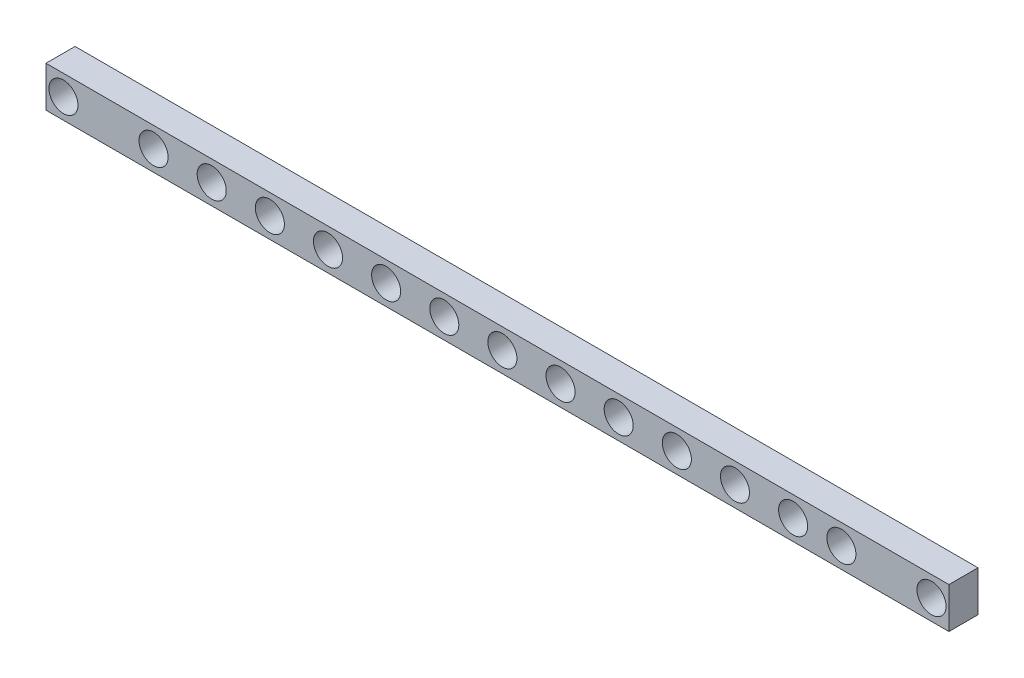
ISO-10303-21;
HEADER;
FILE_DESCRIPTION(('STEP AP214'),'2;1');
FILE_NAME('part.step','',(''),(''),'','','');
FILE_SCHEMA(('AUTOMOTIVE_DESIGN { 1 0 10303 214 1 1 1 1 }'));
ENDSEC;
DATA;
#1=APPLICATION_CONTEXT('core data for automotive mechanical design processes');
#2=APPLICATION_PROTOCOL_DEFINITION('international standard','automotive_design',2000,#1);
#3=PRODUCT_CONTEXT('',#1,'mechanical');
#4=PRODUCT('Part','Part','',(#3));
#5=PRODUCT_RELATED_PRODUCT_CATEGORY('part','',(#4));
#6=PRODUCT_DEFINITION_FORMATION('','',#4);
#7=PRODUCT_DEFINITION_CONTEXT('part definition',#1,'design');
#8=PRODUCT_DEFINITION('design','',#6,#7);
#9=PRODUCT_DEFINITION_SHAPE('','',#8);
#10=(LENGTH_UNIT() NAMED_UNIT(*) SI_UNIT(.MILLI.,.METRE.));
#11=(NAMED_UNIT(*) PLANE_ANGLE_UNIT() SI_UNIT($,.RADIAN.));
#12=(NAMED_UNIT(*) SI_UNIT($,.STERADIAN.) SOLID_ANGLE_UNIT());
#13=UNCERTAINTY_MEASURE_WITH_UNIT(LENGTH_MEASURE(1.E-05),#10,'distance_accuracy_value','');
#14=(GEOMETRIC_REPRESENTATION_CONTEXT(3) GLOBAL_UNCERTAINTY_ASSIGNED_CONTEXT((#13)) GLOBAL_UNIT_ASSIGNED_CONTEXT((#10,
#11,#12)) REPRESENTATION_CONTEXT('',''));
#15=CARTESIAN_POINT('',(0.,0.,0.));
#16=DIRECTION('',(0.,0.,1.));
#17=DIRECTION('',(1.,0.,0.));
#18=AXIS2_PLACEMENT_3D('',#15,#16,#17);
#19=CARTESIAN_POINT('',(0.,0.,0.5));
#20=DIRECTION('',(0.,0.,1.));
#21=DIRECTION('',(1.,0.,0.));
#22=AXIS2_PLACEMENT_3D('',#19,#20,#21);
#23=PLANE('',#22);
#24=CARTESIAN_POINT('',(4.085,0.,0.5));
#25=DIRECTION('',(0.,0.,1.));
#26=DIRECTION('',(1.,0.,0.));
#27=AXIS2_PLACEMENT_3D('',#24,#25,#26);
#28=CIRCLE('',#27,0.25);
#29=CARTESIAN_POINT('',(4.335,0.,0.5));
#30=VERTEX_POINT('',#29);
#31=EDGE_CURVE('E187',#30,#30,#28,.T.);
#32=ORIENTED_EDGE('',*,*,#31,.F.);
#33=EDGE_LOOP('',(#32));
#34=FACE_BOUND('',#33,.T.);
#35=CARTESIAN_POINT('',(2.085,0.,0.5));
#36=DIRECTION('',(0.,0.,1.));
#37=DIRECTION('',(1.,0.,0.));
#38=AXIS2_PLACEMENT_3D('',#35,#36,#37);
#39=CIRCLE('',#38,0.25);
#40=CARTESIAN_POINT('',(2.335,0.,0.5));
#41=VERTEX_POINT('',#40);
#42=EDGE_CURVE('E175',#41,#41,#39,.T.);
#43=ORIENTED_EDGE('',*,*,#42,.F.);
#44=EDGE_LOOP('',(#43));
#45=FACE_BOUND('',#44,.T.);
#46=CARTESIAN_POINT('',(0.0850000000000017,0.,0.5));
#47=DIRECTION('',(0.,0.,1.));
#48=DIRECTION('',(1.,0.,0.));
#49=AXIS2_PLACEMENT_3D('',#46,#47,#48);
#50=CIRCLE('',#49,0.25);
#51=CARTESIAN_POINT('',(0.335000000000002,0.,0.5));
#52=VERTEX_POINT('',#51);
#53=EDGE_CURVE('E163',#52,#52,#50,.T.);
#54=ORIENTED_EDGE('',*,*,#53,.F.);
#55=EDGE_LOOP('',(#54));
#56=FACE_BOUND('',#55,.T.);
#57=CARTESIAN_POINT('',(-1.915,0.,0.5));
#58=DIRECTION('',(0.,0.,1.));
#59=DIRECTION('',(1.,0.,0.));
#60=AXIS2_PLACEMENT_3D('',#57,#58,#59);
#61=CIRCLE('',#60,0.25);
#62=CARTESIAN_POINT('',(-1.665,0.,0.5));
#63=VERTEX_POINT('',#62);
#64=EDGE_CURVE('E151',#63,#63,#61,.T.);
#65=ORIENTED_EDGE('',*,*,#64,.F.);
#66=EDGE_LOOP('',(#65));
#67=FACE_BOUND('',#66,.T.);
#68=CARTESIAN_POINT('',(-3.915,0.,0.5));
#69=DIRECTION('',(0.,0.,1.));
#70=DIRECTION('',(1.,0.,0.));
#71=AXIS2_PLACEMENT_3D('',#68,#69,#70);
#72=CIRCLE('',#71,0.25);
#73=CARTESIAN_POINT('',(-3.665,0.,0.5));
#74=VERTEX_POINT('',#73);
#75=EDGE_CURVE('E139',#74,#74,#72,.T.);
#76=ORIENTED_EDGE('',*,*,#75,.F.);
#77=EDGE_LOOP('',(#76));
#78=FACE_BOUND('',#77,.T.);
#79=CARTESIAN_POINT('',(7.465,0.,0.5));
#80=DIRECTION('',(0.,0.,1.));
#81=DIRECTION('',(-1.,0.,0.));
#82=AXIS2_PLACEMENT_3D('',#79,#80,#81);
#83=CIRCLE('',#82,0.25);
#84=CARTESIAN_POINT('',(7.215,0.,0.5));
#85=VERTEX_POINT('',#84);
#86=EDGE_CURVE('E127',#85,#85,#83,.T.);
#87=ORIENTED_EDGE('',*,*,#86,.F.);
#88=EDGE_LOOP('',(#87));
#89=FACE_BOUND('',#88,.T.);
#90=CARTESIAN_POINT('',(-5.915,0.,0.5));
#91=DIRECTION('',(0.,0.,1.));
#92=DIRECTION('',(1.,0.,0.));
#93=AXIS2_PLACEMENT_3D('',#90,#91,#92);
#94=CIRCLE('',#93,0.25);
#95=CARTESIAN_POINT('',(-5.665,0.,0.5));
#96=VERTEX_POINT('',#95);
#97=EDGE_CURVE('E115',#96,#96,#94,.T.);
#98=ORIENTED_EDGE('',*,*,#97,.F.);
#99=EDGE_LOOP('',(#98));
#100=FACE_BOUND('',#99,.T.);
#101=DIRECTION('',(0.,1.,0.));
#102=VECTOR('',#101,1.);
#103=CARTESIAN_POINT('',(7.765,0.35,0.5));
#104=LINE('',#103,#102);
#105=CARTESIAN_POINT('',(7.765,-0.35,0.5));
#106=VERTEX_POINT('',#105);
#107=CARTESIAN_POINT('',(7.765,0.35,0.5));
#108=VERTEX_POINT('',#107);
#109=EDGE_CURVE('E85',#106,#108,#104,.T.);
#110=ORIENTED_EDGE('',*,*,#109,.T.);
#111=DIRECTION('',(-1.,0.,0.));
#112=VECTOR('',#111,1.);
#113=CARTESIAN_POINT('',(-7.765,0.35,0.5));
#114=LINE('',#113,#112);
#115=CARTESIAN_POINT('',(-7.765,0.35,0.5));
#116=VERTEX_POINT('',#115);
#117=EDGE_CURVE('E80',#108,#116,#114,.T.);
#118=ORIENTED_EDGE('',*,*,#117,.T.);
#119=DIRECTION('',(0.,-1.,0.));
#120=VECTOR('',#119,1.);
#121=CARTESIAN_POINT('',(-7.765,0.35,0.5));
#122=LINE('',#121,#120);
#123=CARTESIAN_POINT('',(-7.765,-0.35,0.5));
#124=VERTEX_POINT('',#123);
#125=EDGE_CURVE('E83',#116,#124,#122,.T.);
#126=ORIENTED_EDGE('',*,*,#125,.T.);
#127=DIRECTION('',(1.,0.,0.));
#128=VECTOR('',#127,1.);
#129=CARTESIAN_POINT('',(-7.765,-0.35,0.5));
#130=LINE('',#129,#128);
#131=EDGE_CURVE('E50',#124,#106,#130,.T.);
#132=ORIENTED_EDGE('',*,*,#131,.T.);
#133=EDGE_LOOP('',(#110,#118,#126,#132));
#134=FACE_BOUND('',#133,.T.);
#135=CARTESIAN_POINT('',(-7.465,0.,0.5));
#136=DIRECTION('',(0.,0.,1.));
#137=DIRECTION('',(1.,0.,0.));
#138=AXIS2_PLACEMENT_3D('',#135,#136,#137);
#139=CIRCLE('',#138,0.25);
#140=CARTESIAN_POINT('',(-7.215,0.,0.5));
#141=VERTEX_POINT('',#140);
#142=EDGE_CURVE('E100',#141,#141,#139,.T.);
#143=ORIENTED_EDGE('',*,*,#142,.F.);
#144=EDGE_LOOP('',(#143));
#145=FACE_BOUND('',#144,.T.);
#146=CARTESIAN_POINT('',(5.915,0.,0.5));
#147=DIRECTION('',(0.,0.,1.));
#148=DIRECTION('',(-1.,0.,0.));
#149=AXIS2_PLACEMENT_3D('',#146,#147,#148);
#150=CIRCLE('',#149,0.25);
#151=CARTESIAN_POINT('',(5.665,0.,0.5));
#152=VERTEX_POINT('',#151);
#153=EDGE_CURVE('E121',#152,#152,#150,.T.);
#154=ORIENTED_EDGE('',*,*,#153,.F.);
#155=EDGE_LOOP('',(#154));
#156=FACE_BOUND('',#155,.T.);
#157=CARTESIAN_POINT('',(-4.915,0.,0.5));
#158=DIRECTION('',(0.,0.,1.));
#159=DIRECTION('',(1.,0.,0.));
#160=AXIS2_PLACEMENT_3D('',#157,#158,#159);
#161=CIRCLE('',#160,0.25);
#162=CARTESIAN_POINT('',(-4.665,0.,0.5));
#163=VERTEX_POINT('',#162);
#164=EDGE_CURVE('E133',#163,#163,#161,.T.);
#165=ORIENTED_EDGE('',*,*,#164,.F.);
#166=EDGE_LOOP('',(#165));
#167=FACE_BOUND('',#166,.T.);
#168=CARTESIAN_POINT('',(-2.915,0.,0.5));
#169=DIRECTION('',(0.,0.,1.));
#170=DIRECTION('',(1.,0.,0.));
#171=AXIS2_PLACEMENT_3D('',#168,#169,#170);
#172=CIRCLE('',#171,0.25);
#173=CARTESIAN_POINT('',(-2.665,0.,0.5));
#174=VERTEX_POINT('',#173);
#175=EDGE_CURVE('E145',#174,#174,#172,.T.);
#176=ORIENTED_EDGE('',*,*,#175,.F.);
#177=EDGE_LOOP('',(#176));
#178=FACE_BOUND('',#177,.T.);
#179=CARTESIAN_POINT('',(-0.914999999999998,0.,0.5));
#180=DIRECTION('',(0.,0.,1.));
#181=DIRECTION('',(1.,0.,0.));
#182=AXIS2_PLACEMENT_3D('',#179,#180,#181);
#183=CIRCLE('',#182,0.25);
#184=CARTESIAN_POINT('',(-0.664999999999998,0.,0.5));
#185=VERTEX_POINT('',#184);
#186=EDGE_CURVE('E157',#185,#185,#183,.T.);
#187=ORIENTED_EDGE('',*,*,#186,.F.);
#188=EDGE_LOOP('',(#187));
#189=FACE_BOUND('',#188,.T.);
#190=CARTESIAN_POINT('',(1.085,0.,0.5));
#191=DIRECTION('',(0.,0.,1.));
#192=DIRECTION('',(1.,0.,0.));
#193=AXIS2_PLACEMENT_3D('',#190,#191,#192);
#194=CIRCLE('',#193,0.25);
#195=CARTESIAN_POINT('',(1.335,0.,0.5));
#196=VERTEX_POINT('',#195);
#197=EDGE_CURVE('E169',#196,#196,#194,.T.);
#198=ORIENTED_EDGE('',*,*,#197,.F.);
#199=EDGE_LOOP('',(#198));
#200=FACE_BOUND('',#199,.T.);
#201=CARTESIAN_POINT('',(3.085,0.,0.5));
#202=DIRECTION('',(0.,0.,1.));
#203=DIRECTION('',(1.,0.,0.));
#204=AXIS2_PLACEMENT_3D('',#201,#202,#203);
#205=CIRCLE('',#204,0.25);
#206=CARTESIAN_POINT('',(3.335,0.,0.5));
#207=VERTEX_POINT('',#206);
#208=EDGE_CURVE('E181',#207,#207,#205,.T.);
#209=ORIENTED_EDGE('',*,*,#208,.F.);
#210=EDGE_LOOP('',(#209));
#211=FACE_BOUND('',#210,.T.);
#212=CARTESIAN_POINT('',(5.085,0.,0.5));
#213=DIRECTION('',(0.,0.,1.));
#214=DIRECTION('',(1.,0.,0.));
#215=AXIS2_PLACEMENT_3D('',#212,#213,#214);
#216=CIRCLE('',#215,0.25);
#217=CARTESIAN_POINT('',(5.335,0.,0.5));
#218=VERTEX_POINT('',#217);
#219=EDGE_CURVE('E193',#218,#218,#216,.T.);
#220=ORIENTED_EDGE('',*,*,#219,.F.);
#221=EDGE_LOOP('',(#220));
#222=FACE_BOUND('',#221,.T.);
#223=ADVANCED_FACE('F33',(#34,#45,#56,#67,#78,#89,#100,#134,#145,#156,#167,#178,#189,#200,#211,
#222),#23,.T.);
#224=CARTESIAN_POINT('',(0.,0.,0.));
#225=DIRECTION('',(0.,0.,1.));
#226=DIRECTION('',(1.,0.,0.));
#227=AXIS2_PLACEMENT_3D('',#224,#225,#226);
#228=PLANE('',#227);
#229=DIRECTION('',(0.,1.,0.));
#230=VECTOR('',#229,1.);
#231=CARTESIAN_POINT('',(7.765,0.35,0.));
#232=LINE('',#231,#230);
#233=CARTESIAN_POINT('',(7.765,-0.35,0.));
#234=VERTEX_POINT('',#233);
#235=CARTESIAN_POINT('',(7.765,0.35,0.));
#236=VERTEX_POINT('',#235);
#237=EDGE_CURVE('E97',#234,#236,#232,.T.);
#238=ORIENTED_EDGE('',*,*,#237,.F.);
#239=DIRECTION('',(1.,0.,0.));
#240=VECTOR('',#239,1.);
#241=CARTESIAN_POINT('',(-7.765,-0.35,0.));
#242=LINE('',#241,#240);
#243=CARTESIAN_POINT('',(-7.765,-0.35,0.));
#244=VERTEX_POINT('',#243);
#245=EDGE_CURVE('E73',#244,#234,#242,.T.);
#246=ORIENTED_EDGE('',*,*,#245,.F.);
#247=DIRECTION('',(0.,-1.,0.));
#248=VECTOR('',#247,1.);
#249=CARTESIAN_POINT('',(-7.765,0.35,0.));
#250=LINE('',#249,#248);
#251=CARTESIAN_POINT('',(-7.765,0.35,0.));
#252=VERTEX_POINT('',#251);
#253=EDGE_CURVE('E67',#252,#244,#250,.T.);
#254=ORIENTED_EDGE('',*,*,#253,.F.);
#255=DIRECTION('',(-1.,0.,0.));
#256=VECTOR('',#255,1.);
#257=CARTESIAN_POINT('',(-7.765,0.35,0.));
#258=LINE('',#257,#256);
#259=EDGE_CURVE('E89',#236,#252,#258,.T.);
#260=ORIENTED_EDGE('',*,*,#259,.F.);
#261=EDGE_LOOP('',(#238,#246,#254,#260));
#262=FACE_BOUND('',#261,.T.);
#263=CARTESIAN_POINT('',(-7.465,0.,0.));
#264=DIRECTION('',(0.,0.,1.));
#265=DIRECTION('',(1.,0.,0.));
#266=AXIS2_PLACEMENT_3D('',#263,#264,#265);
#267=CIRCLE('',#266,0.25);
#268=CARTESIAN_POINT('',(-7.215,0.,0.));
#269=VERTEX_POINT('',#268);
#270=EDGE_CURVE('E112',#269,#269,#267,.T.);
#271=ORIENTED_EDGE('',*,*,#270,.T.);
#272=EDGE_LOOP('',(#271));
#273=FACE_BOUND('',#272,.T.);
#274=CARTESIAN_POINT('',(-5.915,0.,0.));
#275=DIRECTION('',(0.,0.,1.));
#276=DIRECTION('',(1.,0.,0.));
#277=AXIS2_PLACEMENT_3D('',#274,#275,#276);
#278=CIRCLE('',#277,0.25);
#279=CARTESIAN_POINT('',(-5.665,0.,0.));
#280=VERTEX_POINT('',#279);
#281=EDGE_CURVE('E118',#280,#280,#278,.T.);
#282=ORIENTED_EDGE('',*,*,#281,.T.);
#283=EDGE_LOOP('',(#282));
#284=FACE_BOUND('',#283,.T.);
#285=CARTESIAN_POINT('',(5.915,0.,0.));
#286=DIRECTION('',(0.,0.,1.));
#287=DIRECTION('',(-1.,0.,0.));
#288=AXIS2_PLACEMENT_3D('',#285,#286,#287);
#289=CIRCLE('',#288,0.25);
#290=CARTESIAN_POINT('',(5.665,0.,0.));
#291=VERTEX_POINT('',#290);
#292=EDGE_CURVE('E124',#291,#291,#289,.T.);
#293=ORIENTED_EDGE('',*,*,#292,.T.);
#294=EDGE_LOOP('',(#293));
#295=FACE_BOUND('',#294,.T.);
#296=CARTESIAN_POINT('',(7.465,0.,0.));
#297=DIRECTION('',(0.,0.,1.));
#298=DIRECTION('',(-1.,0.,0.));
#299=AXIS2_PLACEMENT_3D('',#296,#297,#298);
#300=CIRCLE('',#299,0.25);
#301=CARTESIAN_POINT('',(7.215,0.,0.));
#302=VERTEX_POINT('',#301);
#303=EDGE_CURVE('E130',#302,#302,#300,.T.);
#304=ORIENTED_EDGE('',*,*,#303,.T.);
#305=EDGE_LOOP('',(#304));
#306=FACE_BOUND('',#305,.T.);
#307=CARTESIAN_POINT('',(-4.915,0.,0.));
#308=DIRECTION('',(0.,0.,1.));
#309=DIRECTION('',(1.,0.,0.));
#310=AXIS2_PLACEMENT_3D('',#307,#308,#309);
#311=CIRCLE('',#310,0.25);
#312=CARTESIAN_POINT('',(-4.665,0.,0.));
#313=VERTEX_POINT('',#312);
#314=EDGE_CURVE('E136',#313,#313,#311,.T.);
#315=ORIENTED_EDGE('',*,*,#314,.T.);
#316=EDGE_LOOP('',(#315));
#317=FACE_BOUND('',#316,.T.);
#318=CARTESIAN_POINT('',(-3.915,0.,0.));
#319=DIRECTION('',(0.,0.,1.));
#320=DIRECTION('',(1.,0.,0.));
#321=AXIS2_PLACEMENT_3D('',#318,#319,#320);
#322=CIRCLE('',#321,0.25);
#323=CARTESIAN_POINT('',(-3.665,0.,0.));
#324=VERTEX_POINT('',#323);
#325=EDGE_CURVE('E142',#324,#324,#322,.T.);
#326=ORIENTED_EDGE('',*,*,#325,.T.);
#327=EDGE_LOOP('',(#326));
#328=FACE_BOUND('',#327,.T.);
#329=CARTESIAN_POINT('',(-2.915,0.,0.));
#330=DIRECTION('',(0.,0.,1.));
#331=DIRECTION('',(1.,0.,0.));
#332=AXIS2_PLACEMENT_3D('',#329,#330,#331);
#333=CIRCLE('',#332,0.25);
#334=CARTESIAN_POINT('',(-2.665,0.,0.));
#335=VERTEX_POINT('',#334);
#336=EDGE_CURVE('E148',#335,#335,#333,.T.);
#337=ORIENTED_EDGE('',*,*,#336,.T.);
#338=EDGE_LOOP('',(#337));
#339=FACE_BOUND('',#338,.T.);
#340=CARTESIAN_POINT('',(-1.915,0.,0.));
#341=DIRECTION('',(0.,0.,1.));
#342=DIRECTION('',(1.,0.,0.));
#343=AXIS2_PLACEMENT_3D('',#340,#341,#342);
#344=CIRCLE('',#343,0.25);
#345=CARTESIAN_POINT('',(-1.665,0.,0.));
#346=VERTEX_POINT('',#345);
#347=EDGE_CURVE('E154',#346,#346,#344,.T.);
#348=ORIENTED_EDGE('',*,*,#347,.T.);
#349=EDGE_LOOP('',(#348));
#350=FACE_BOUND('',#349,.T.);
#351=CARTESIAN_POINT('',(-0.914999999999998,0.,0.));
#352=DIRECTION('',(0.,0.,1.));
#353=DIRECTION('',(1.,0.,0.));
#354=AXIS2_PLACEMENT_3D('',#351,#352,#353);
#355=CIRCLE('',#354,0.25);
#356=CARTESIAN_POINT('',(-0.664999999999998,0.,0.));
#357=VERTEX_POINT('',#356);
#358=EDGE_CURVE('E160',#357,#357,#355,.T.);
#359=ORIENTED_EDGE('',*,*,#358,.T.);
#360=EDGE_LOOP('',(#359));
#361=FACE_BOUND('',#360,.T.);
#362=CARTESIAN_POINT('',(0.0850000000000017,0.,0.));
#363=DIRECTION('',(0.,0.,1.));
#364=DIRECTION('',(1.,0.,0.));
#365=AXIS2_PLACEMENT_3D('',#362,#363,#364);
#366=CIRCLE('',#365,0.25);
#367=CARTESIAN_POINT('',(0.335000000000002,0.,0.));
#368=VERTEX_POINT('',#367);
#369=EDGE_CURVE('E166',#368,#368,#366,.T.);
#370=ORIENTED_EDGE('',*,*,#369,.T.);
#371=EDGE_LOOP('',(#370));
#372=FACE_BOUND('',#371,.T.);
#373=CARTESIAN_POINT('',(1.085,0.,0.));
#374=DIRECTION('',(0.,0.,1.));
#375=DIRECTION('',(1.,0.,0.));
#376=AXIS2_PLACEMENT_3D('',#373,#374,#375);
#377=CIRCLE('',#376,0.25);
#378=CARTESIAN_POINT('',(1.335,0.,0.));
#379=VERTEX_POINT('',#378);
#380=EDGE_CURVE('E172',#379,#379,#377,.T.);
#381=ORIENTED_EDGE('',*,*,#380,.T.);
#382=EDGE_LOOP('',(#381));
#383=FACE_BOUND('',#382,.T.);
#384=CARTESIAN_POINT('',(2.085,0.,0.));
#385=DIRECTION('',(0.,0.,1.));
#386=DIRECTION('',(1.,0.,0.));
#387=AXIS2_PLACEMENT_3D('',#384,#385,#386);
#388=CIRCLE('',#387,0.25);
#389=CARTESIAN_POINT('',(2.335,0.,0.));
#390=VERTEX_POINT('',#389);
#391=EDGE_CURVE('E178',#390,#390,#388,.T.);
#392=ORIENTED_EDGE('',*,*,#391,.T.);
#393=EDGE_LOOP('',(#392));
#394=FACE_BOUND('',#393,.T.);
#395=CARTESIAN_POINT('',(3.085,0.,0.));
#396=DIRECTION('',(0.,0.,1.));
#397=DIRECTION('',(1.,0.,0.));
#398=AXIS2_PLACEMENT_3D('',#395,#396,#397);
#399=CIRCLE('',#398,0.25);
#400=CARTESIAN_POINT('',(3.335,0.,0.));
#401=VERTEX_POINT('',#400);
#402=EDGE_CURVE('E184',#401,#401,#399,.T.);
#403=ORIENTED_EDGE('',*,*,#402,.T.);
#404=EDGE_LOOP('',(#403));
#405=FACE_BOUND('',#404,.T.);
#406=CARTESIAN_POINT('',(4.085,0.,0.));
#407=DIRECTION('',(0.,0.,1.));
#408=DIRECTION('',(1.,0.,0.));
#409=AXIS2_PLACEMENT_3D('',#406,#407,#408);
#410=CIRCLE('',#409,0.25);
#411=CARTESIAN_POINT('',(4.335,0.,0.));
#412=VERTEX_POINT('',#411);
#413=EDGE_CURVE('E190',#412,#412,#410,.T.);
#414=ORIENTED_EDGE('',*,*,#413,.T.);
#415=EDGE_LOOP('',(#414));
#416=FACE_BOUND('',#415,.T.);
#417=CARTESIAN_POINT('',(5.085,0.,0.));
#418=DIRECTION('',(0.,0.,1.));
#419=DIRECTION('',(1.,0.,0.));
#420=AXIS2_PLACEMENT_3D('',#417,#418,#419);
#421=CIRCLE('',#420,0.25);
#422=CARTESIAN_POINT('',(5.335,0.,0.));
#423=VERTEX_POINT('',#422);
#424=EDGE_CURVE('E196',#423,#423,#421,.T.);
#425=ORIENTED_EDGE('',*,*,#424,.T.);
#426=EDGE_LOOP('',(#425));
#427=FACE_BOUND('',#426,.T.);
#428=ADVANCED_FACE('F108',(#262,#273,#284,#295,#306,#317,#328,#339,#350,#361,#372,#383,#394,
#405,#416,#427),#228,.F.);
#429=CARTESIAN_POINT('',(7.765,0.35,0.5));
#430=DIRECTION('',(-1.,0.,0.));
#431=DIRECTION('',(0.,0.,1.));
#432=AXIS2_PLACEMENT_3D('',#429,#430,#431);
#433=PLANE('',#432);
#434=ORIENTED_EDGE('',*,*,#237,.T.);
#435=DIRECTION('',(0.,0.,-1.));
#436=VECTOR('',#435,1.);
#437=CARTESIAN_POINT('',(7.765,0.35,0.5));
#438=LINE('',#437,#436);
#439=EDGE_CURVE('E11',#108,#236,#438,.T.);
#440=ORIENTED_EDGE('',*,*,#439,.F.);
#441=ORIENTED_EDGE('',*,*,#109,.F.);
#442=DIRECTION('',(0.,0.,-1.));
#443=VECTOR('',#442,1.);
#444=CARTESIAN_POINT('',(7.765,-0.35,0.5));
#445=LINE('',#444,#443);
#446=EDGE_CURVE('E93',#106,#234,#445,.T.);
#447=ORIENTED_EDGE('',*,*,#446,.T.);
#448=EDGE_LOOP('',(#434,#440,#441,#447));
#449=FACE_BOUND('',#448,.T.);
#450=ADVANCED_FACE('F35',(#449),#433,.F.);
#451=CARTESIAN_POINT('',(-7.765,0.35,0.5));
#452=DIRECTION('',(0.,-1.,0.));
#453=DIRECTION('',(0.,0.,-1.));
#454=AXIS2_PLACEMENT_3D('',#451,#452,#453);
#455=PLANE('',#454);
#456=ORIENTED_EDGE('',*,*,#259,.T.);
#457=DIRECTION('',(0.,0.,-1.));
#458=VECTOR('',#457,1.);
#459=CARTESIAN_POINT('',(-7.765,0.35,0.5));
#460=LINE('',#459,#458);
#461=EDGE_CURVE('E42',#116,#252,#460,.T.);
#462=ORIENTED_EDGE('',*,*,#461,.F.);
#463=ORIENTED_EDGE('',*,*,#117,.F.);
#464=ORIENTED_EDGE('',*,*,#439,.T.);
#465=EDGE_LOOP('',(#456,#462,#463,#464));
#466=FACE_BOUND('',#465,.T.);
#467=ADVANCED_FACE('F88',(#466),#455,.F.);
#468=CARTESIAN_POINT('',(-7.765,0.35,0.5));
#469=DIRECTION('',(1.,0.,0.));
#470=DIRECTION('',(0.,0.,-1.));
#471=AXIS2_PLACEMENT_3D('',#468,#469,#470);
#472=PLANE('',#471);
#473=ORIENTED_EDGE('',*,*,#253,.T.);
#474=DIRECTION('',(0.,0.,-1.));
#475=VECTOR('',#474,1.);
#476=CARTESIAN_POINT('',(-7.765,-0.35,0.5));
#477=LINE('',#476,#475);
#478=EDGE_CURVE('E90',#124,#244,#477,.T.);
#479=ORIENTED_EDGE('',*,*,#478,.F.);
#480=ORIENTED_EDGE('',*,*,#125,.F.);
#481=ORIENTED_EDGE('',*,*,#461,.T.);
#482=EDGE_LOOP('',(#473,#479,#480,#481));
#483=FACE_BOUND('',#482,.T.);
#484=ADVANCED_FACE('F91',(#483),#472,.F.);
#485=CARTESIAN_POINT('',(-7.765,-0.35,0.5));
#486=DIRECTION('',(0.,1.,0.));
#487=DIRECTION('',(0.,0.,1.));
#488=AXIS2_PLACEMENT_3D('',#485,#486,#487);
#489=PLANE('',#488);
#490=ORIENTED_EDGE('',*,*,#245,.T.);
#491=ORIENTED_EDGE('',*,*,#446,.F.);
#492=ORIENTED_EDGE('',*,*,#131,.F.);
#493=ORIENTED_EDGE('',*,*,#478,.T.);
#494=EDGE_LOOP('',(#490,#491,#492,#493));
#495=FACE_BOUND('',#494,.T.);
#496=ADVANCED_FACE('F105',(#495),#489,.F.);
#497=CARTESIAN_POINT('',(-7.465,0.,0.5));
#498=DIRECTION('',(0.,0.,-1.));
#499=DIRECTION('',(-1.,0.,0.));
#500=AXIS2_PLACEMENT_3D('',#497,#498,#499);
#501=CYLINDRICAL_SURFACE('',#500,0.25);
#502=ORIENTED_EDGE('',*,*,#142,.T.);
#503=EDGE_LOOP('',(#502));
#504=FACE_BOUND('',#503,.T.);
#505=ORIENTED_EDGE('',*,*,#270,.F.);
#506=EDGE_LOOP('',(#505));
#507=FACE_BOUND('',#506,.T.);
#508=ADVANCED_FACE('F215',(#504,#507),#501,.F.);
#509=CARTESIAN_POINT('',(-5.915,0.,0.5));
#510=DIRECTION('',(0.,0.,-1.));
#511=DIRECTION('',(-1.,0.,0.));
#512=AXIS2_PLACEMENT_3D('',#509,#510,#511);
#513=CYLINDRICAL_SURFACE('',#512,0.25);
#514=ORIENTED_EDGE('',*,*,#97,.T.);
#515=EDGE_LOOP('',(#514));
#516=FACE_BOUND('',#515,.T.);
#517=ORIENTED_EDGE('',*,*,#281,.F.);
#518=EDGE_LOOP('',(#517));
#519=FACE_BOUND('',#518,.T.);
#520=ADVANCED_FACE('F261',(#516,#519),#513,.F.);
#521=CARTESIAN_POINT('',(5.915,0.,0.5));
#522=DIRECTION('',(0.,0.,-1.));
#523=DIRECTION('',(-1.,0.,0.));
#524=AXIS2_PLACEMENT_3D('',#521,#522,#523);
#525=CYLINDRICAL_SURFACE('',#524,0.25);
#526=ORIENTED_EDGE('',*,*,#153,.T.);
#527=EDGE_LOOP('',(#526));
#528=FACE_BOUND('',#527,.T.);
#529=ORIENTED_EDGE('',*,*,#292,.F.);
#530=EDGE_LOOP('',(#529));
#531=FACE_BOUND('',#530,.T.);
#532=ADVANCED_FACE('F269',(#528,#531),#525,.F.);
#533=CARTESIAN_POINT('',(7.465,0.,0.5));
#534=DIRECTION('',(0.,0.,-1.));
#535=DIRECTION('',(-1.,0.,0.));
#536=AXIS2_PLACEMENT_3D('',#533,#534,#535);
#537=CYLINDRICAL_SURFACE('',#536,0.25);
#538=ORIENTED_EDGE('',*,*,#86,.T.);
#539=EDGE_LOOP('',(#538));
#540=FACE_BOUND('',#539,.T.);
#541=ORIENTED_EDGE('',*,*,#303,.F.);
#542=EDGE_LOOP('',(#541));
#543=FACE_BOUND('',#542,.T.);
#544=ADVANCED_FACE('F277',(#540,#543),#537,.F.);
#545=CARTESIAN_POINT('',(-4.915,0.,0.5));
#546=DIRECTION('',(0.,0.,-1.));
#547=DIRECTION('',(-1.,0.,0.));
#548=AXIS2_PLACEMENT_3D('',#545,#546,#547);
#549=CYLINDRICAL_SURFACE('',#548,0.25);
#550=ORIENTED_EDGE('',*,*,#164,.T.);
#551=EDGE_LOOP('',(#550));
#552=FACE_BOUND('',#551,.T.);
#553=ORIENTED_EDGE('',*,*,#314,.F.);
#554=EDGE_LOOP('',(#553));
#555=FACE_BOUND('',#554,.T.);
#556=ADVANCED_FACE('F286',(#552,#555),#549,.F.);
#557=CARTESIAN_POINT('',(-3.915,0.,0.5));
#558=DIRECTION('',(0.,0.,-1.));
#559=DIRECTION('',(-1.,0.,0.));
#560=AXIS2_PLACEMENT_3D('',#557,#558,#559);
#561=CYLINDRICAL_SURFACE('',#560,0.25);
#562=ORIENTED_EDGE('',*,*,#75,.T.);
#563=EDGE_LOOP('',(#562));
#564=FACE_BOUND('',#563,.T.);
#565=ORIENTED_EDGE('',*,*,#325,.F.);
#566=EDGE_LOOP('',(#565));
#567=FACE_BOUND('',#566,.T.);
#568=ADVANCED_FACE('F295',(#564,#567),#561,.F.);
#569=CARTESIAN_POINT('',(-2.915,0.,0.5));
#570=DIRECTION('',(0.,0.,-1.));
#571=DIRECTION('',(-1.,0.,0.));
#572=AXIS2_PLACEMENT_3D('',#569,#570,#571);
#573=CYLINDRICAL_SURFACE('',#572,0.25);
#574=ORIENTED_EDGE('',*,*,#175,.T.);
#575=EDGE_LOOP('',(#574));
#576=FACE_BOUND('',#575,.T.);
#577=ORIENTED_EDGE('',*,*,#336,.F.);
#578=EDGE_LOOP('',(#577));
#579=FACE_BOUND('',#578,.T.);
#580=ADVANCED_FACE('F304',(#576,#579),#573,.F.);
#581=CARTESIAN_POINT('',(-1.915,0.,0.5));
#582=DIRECTION('',(0.,0.,-1.));
#583=DIRECTION('',(-1.,0.,0.));
#584=AXIS2_PLACEMENT_3D('',#581,#582,#583);
#585=CYLINDRICAL_SURFACE('',#584,0.25);
#586=ORIENTED_EDGE('',*,*,#64,.T.);
#587=EDGE_LOOP('',(#586));
#588=FACE_BOUND('',#587,.T.);
#589=ORIENTED_EDGE('',*,*,#347,.F.);
#590=EDGE_LOOP('',(#589));
#591=FACE_BOUND('',#590,.T.);
#592=ADVANCED_FACE('F313',(#588,#591),#585,.F.);
#593=CARTESIAN_POINT('',(-0.914999999999998,0.,0.5));
#594=DIRECTION('',(0.,0.,-1.));
#595=DIRECTION('',(-1.,0.,0.));
#596=AXIS2_PLACEMENT_3D('',#593,#594,#595);
#597=CYLINDRICAL_SURFACE('',#596,0.25);
#598=ORIENTED_EDGE('',*,*,#186,.T.);
#599=EDGE_LOOP('',(#598));
#600=FACE_BOUND('',#599,.T.);
#601=ORIENTED_EDGE('',*,*,#358,.F.);
#602=EDGE_LOOP('',(#601));
#603=FACE_BOUND('',#602,.T.);
#604=ADVANCED_FACE('F322',(#600,#603),#597,.F.);
#605=CARTESIAN_POINT('',(0.0850000000000017,0.,0.5));
#606=DIRECTION('',(0.,0.,-1.));
#607=DIRECTION('',(-1.,0.,0.));
#608=AXIS2_PLACEMENT_3D('',#605,#606,#607);
#609=CYLINDRICAL_SURFACE('',#608,0.25);
#610=ORIENTED_EDGE('',*,*,#53,.T.);
#611=EDGE_LOOP('',(#610));
#612=FACE_BOUND('',#611,.T.);
#613=ORIENTED_EDGE('',*,*,#369,.F.);
#614=EDGE_LOOP('',(#613));
#615=FACE_BOUND('',#614,.T.);
#616=ADVANCED_FACE('F331',(#612,#615),#609,.F.);
#617=CARTESIAN_POINT('',(1.085,0.,0.5));
#618=DIRECTION('',(0.,0.,-1.));
#619=DIRECTION('',(-1.,0.,0.));
#620=AXIS2_PLACEMENT_3D('',#617,#618,#619);
#621=CYLINDRICAL_SURFACE('',#620,0.25);
#622=ORIENTED_EDGE('',*,*,#197,.T.);
#623=EDGE_LOOP('',(#622));
#624=FACE_BOUND('',#623,.T.);
#625=ORIENTED_EDGE('',*,*,#380,.F.);
#626=EDGE_LOOP('',(#625));
#627=FACE_BOUND('',#626,.T.);
#628=ADVANCED_FACE('F340',(#624,#627),#621,.F.);
#629=CARTESIAN_POINT('',(2.085,0.,0.5));
#630=DIRECTION('',(0.,0.,-1.));
#631=DIRECTION('',(-1.,0.,0.));
#632=AXIS2_PLACEMENT_3D('',#629,#630,#631);
#633=CYLINDRICAL_SURFACE('',#632,0.25);
#634=ORIENTED_EDGE('',*,*,#42,.T.);
#635=EDGE_LOOP('',(#634));
#636=FACE_BOUND('',#635,.T.);
#637=ORIENTED_EDGE('',*,*,#391,.F.);
#638=EDGE_LOOP('',(#637));
#639=FACE_BOUND('',#638,.T.);
#640=ADVANCED_FACE('F349',(#636,#639),#633,.F.);
#641=CARTESIAN_POINT('',(3.085,0.,0.5));
#642=DIRECTION('',(0.,0.,-1.));
#643=DIRECTION('',(-1.,0.,0.));
#644=AXIS2_PLACEMENT_3D('',#641,#642,#643);
#645=CYLINDRICAL_SURFACE('',#644,0.25);
#646=ORIENTED_EDGE('',*,*,#208,.T.);
#647=EDGE_LOOP('',(#646));
#648=FACE_BOUND('',#647,.T.);
#649=ORIENTED_EDGE('',*,*,#402,.F.);
#650=EDGE_LOOP('',(#649));
#651=FACE_BOUND('',#650,.T.);
#652=ADVANCED_FACE('F358',(#648,#651),#645,.F.);
#653=CARTESIAN_POINT('',(4.085,0.,0.5));
#654=DIRECTION('',(0.,0.,-1.));
#655=DIRECTION('',(-1.,0.,0.));
#656=AXIS2_PLACEMENT_3D('',#653,#654,#655);
#657=CYLINDRICAL_SURFACE('',#656,0.25);
#658=ORIENTED_EDGE('',*,*,#31,.T.);
#659=EDGE_LOOP('',(#658));
#660=FACE_BOUND('',#659,.T.);
#661=ORIENTED_EDGE('',*,*,#413,.F.);
#662=EDGE_LOOP('',(#661));
#663=FACE_BOUND('',#662,.T.);
#664=ADVANCED_FACE('F367',(#660,#663),#657,.F.);
#665=CARTESIAN_POINT('',(5.085,0.,0.5));
#666=DIRECTION('',(0.,0.,-1.));
#667=DIRECTION('',(-1.,0.,0.));
#668=AXIS2_PLACEMENT_3D('',#665,#666,#667);
#669=CYLINDRICAL_SURFACE('',#668,0.25);
#670=ORIENTED_EDGE('',*,*,#219,.T.);
#671=EDGE_LOOP('',(#670));
#672=FACE_BOUND('',#671,.T.);
#673=ORIENTED_EDGE('',*,*,#424,.F.);
#674=EDGE_LOOP('',(#673));
#675=FACE_BOUND('',#674,.T.);
#676=ADVANCED_FACE('F202',(#672,#675),#669,.F.);
#677=CLOSED_SHELL('',(#223,#428,#450,#467,#484,#496,#508,#520,#532,#544,#556,#568,#580,#592,
#604,#616,#628,#640,#652,#664,#676));
#678=MANIFOLD_SOLID_BREP('B2',#677);
#679=ADVANCED_BREP_SHAPE_REPRESENTATION('',(#18,#678),#14);
#680=SHAPE_DEFINITION_REPRESENTATION(#9,#679);
ENDSEC;
END-ISO-10303-21;
